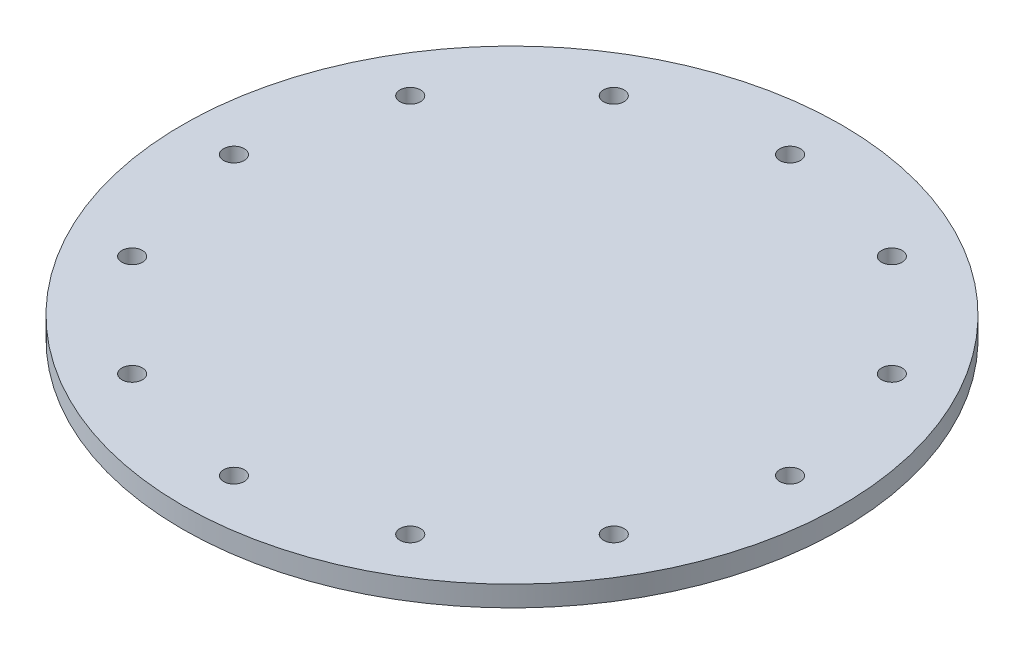
ISO-10303-21;
HEADER;
FILE_DESCRIPTION(('STEP AP214'),'2;1');
FILE_NAME('part.step','',(''),(''),'','','');
FILE_SCHEMA(('AUTOMOTIVE_DESIGN { 1 0 10303 214 1 1 1 1 }'));
ENDSEC;
DATA;
#1=APPLICATION_CONTEXT('core data for automotive mechanical design processes');
#2=APPLICATION_PROTOCOL_DEFINITION('international standard','automotive_design',2000,#1);
#3=PRODUCT_CONTEXT('',#1,'mechanical');
#4=PRODUCT('Part','Part','',(#3));
#5=PRODUCT_RELATED_PRODUCT_CATEGORY('part','',(#4));
#6=PRODUCT_DEFINITION_FORMATION('','',#4);
#7=PRODUCT_DEFINITION_CONTEXT('part definition',#1,'design');
#8=PRODUCT_DEFINITION('design','',#6,#7);
#9=PRODUCT_DEFINITION_SHAPE('','',#8);
#10=(LENGTH_UNIT() NAMED_UNIT(*) SI_UNIT(.MILLI.,.METRE.));
#11=(NAMED_UNIT(*) PLANE_ANGLE_UNIT() SI_UNIT($,.RADIAN.));
#12=(NAMED_UNIT(*) SI_UNIT($,.STERADIAN.) SOLID_ANGLE_UNIT());
#13=UNCERTAINTY_MEASURE_WITH_UNIT(LENGTH_MEASURE(1.E-05),#10,'distance_accuracy_value','');
#14=(GEOMETRIC_REPRESENTATION_CONTEXT(3) GLOBAL_UNCERTAINTY_ASSIGNED_CONTEXT((#13)) GLOBAL_UNIT_ASSIGNED_CONTEXT((#10,
#11,#12)) REPRESENTATION_CONTEXT('',''));
#15=CARTESIAN_POINT('',(0.,0.,0.));
#16=DIRECTION('',(0.,0.,1.));
#17=DIRECTION('',(1.,0.,0.));
#18=AXIS2_PLACEMENT_3D('',#15,#16,#17);
#19=CARTESIAN_POINT('',(0.,6.35,0.));
#20=DIRECTION('',(0.,-1.,0.));
#21=DIRECTION('',(0.,0.,-1.));
#22=AXIS2_PLACEMENT_3D('',#19,#20,#21);
#23=CYLINDRICAL_SURFACE('',#22,101.6);
#24=CARTESIAN_POINT('',(0.,6.35,0.));
#25=DIRECTION('',(0.,1.,0.));
#26=DIRECTION('',(0.,0.,1.));
#27=AXIS2_PLACEMENT_3D('',#24,#25,#26);
#28=CIRCLE('',#27,101.6);
#29=CARTESIAN_POINT('',(0.,6.35,101.6));
#30=VERTEX_POINT('',#29);
#31=EDGE_CURVE('E10',#30,#30,#28,.T.);
#32=ORIENTED_EDGE('',*,*,#31,.F.);
#33=EDGE_LOOP('',(#32));
#34=FACE_BOUND('',#33,.T.);
#35=CARTESIAN_POINT('',(0.,0.,0.));
#36=DIRECTION('',(0.,1.,0.));
#37=DIRECTION('',(0.,0.,1.));
#38=AXIS2_PLACEMENT_3D('',#35,#36,#37);
#39=CIRCLE('',#38,101.6);
#40=CARTESIAN_POINT('',(0.,0.,101.6));
#41=VERTEX_POINT('',#40);
#42=EDGE_CURVE('E38',#41,#41,#39,.T.);
#43=ORIENTED_EDGE('',*,*,#42,.T.);
#44=EDGE_LOOP('',(#43));
#45=FACE_BOUND('',#44,.T.);
#46=ADVANCED_FACE('F35',(#34,#45),#23,.T.);
#47=CARTESIAN_POINT('',(0.,6.35,0.));
#48=DIRECTION('',(0.,1.,0.));
#49=DIRECTION('',(0.,0.,1.));
#50=AXIS2_PLACEMENT_3D('',#47,#48,#49);
#51=PLANE('',#50);
#52=CARTESIAN_POINT('',(-42.8624999999995,6.35,-74.2400277394191));
#53=DIRECTION('',(0.,1.,0.));
#54=DIRECTION('',(0.,0.,1.));
#55=AXIS2_PLACEMENT_3D('',#52,#53,#54);
#56=CIRCLE('',#55,3.1750000000021);
#57=CARTESIAN_POINT('',(-42.8624999999995,6.35,-71.0650277394171));
#58=VERTEX_POINT('',#57);
#59=EDGE_CURVE('E52',#58,#58,#56,.T.);
#60=ORIENTED_EDGE('',*,*,#59,.F.);
#61=EDGE_LOOP('',(#60));
#62=FACE_BOUND('',#61,.T.);
#63=CARTESIAN_POINT('',(42.8625000000001,6.35,-74.2400277394209));
#64=DIRECTION('',(0.,1.,0.));
#65=DIRECTION('',(0.,0.,1.));
#66=AXIS2_PLACEMENT_3D('',#63,#64,#65);
#67=CIRCLE('',#66,3.175);
#68=CARTESIAN_POINT('',(42.8625000000001,6.35,-71.0650277394209));
#69=VERTEX_POINT('',#68);
#70=EDGE_CURVE('E91',#69,#69,#67,.T.);
#71=ORIENTED_EDGE('',*,*,#70,.F.);
#72=EDGE_LOOP('',(#71));
#73=FACE_BOUND('',#72,.T.);
#74=CARTESIAN_POINT('',(74.2400277394228,6.35,-42.8625000000032));
#75=DIRECTION('',(0.,1.,0.));
#76=DIRECTION('',(0.,0.,1.));
#77=AXIS2_PLACEMENT_3D('',#74,#75,#76);
#78=CIRCLE('',#77,3.17500000000101);
#79=CARTESIAN_POINT('',(74.2400277394228,6.35,-39.6875000000022));
#80=VERTEX_POINT('',#79);
#81=EDGE_CURVE('E85',#80,#80,#78,.T.);
#82=ORIENTED_EDGE('',*,*,#81,.F.);
#83=EDGE_LOOP('',(#82));
#84=FACE_BOUND('',#83,.T.);
#85=CARTESIAN_POINT('',(85.7250000000036,6.35,-3.64417827669638E-12));
#86=DIRECTION('',(0.,1.,0.));
#87=DIRECTION('',(0.,0.,1.));
#88=AXIS2_PLACEMENT_3D('',#85,#86,#87);
#89=CIRCLE('',#88,3.1750000000027);
#90=CARTESIAN_POINT('',(85.7250000000036,6.35,3.17499999999906));
#91=VERTEX_POINT('',#90);
#92=EDGE_CURVE('E79',#91,#91,#89,.T.);
#93=ORIENTED_EDGE('',*,*,#92,.F.);
#94=EDGE_LOOP('',(#93));
#95=FACE_BOUND('',#94,.T.);
#96=CARTESIAN_POINT('',(74.2400277394265,6.35,42.8624999999968));
#97=DIRECTION('',(0.,1.,0.));
#98=DIRECTION('',(0.,0.,1.));
#99=AXIS2_PLACEMENT_3D('',#96,#97,#98);
#100=CIRCLE('',#99,3.17500000000469);
#101=CARTESIAN_POINT('',(74.2400277394265,6.35,46.0375000000015));
#102=VERTEX_POINT('',#101);
#103=EDGE_CURVE('E73',#102,#102,#100,.T.);
#104=ORIENTED_EDGE('',*,*,#103,.F.);
#105=EDGE_LOOP('',(#104));
#106=FACE_BOUND('',#105,.T.);
#107=CARTESIAN_POINT('',(42.8625000000068,6.35,74.2400277394192));
#108=DIRECTION('',(0.,1.,0.));
#109=DIRECTION('',(0.,0.,1.));
#110=AXIS2_PLACEMENT_3D('',#107,#108,#109);
#111=CIRCLE('',#110,3.17500000000647);
#112=CARTESIAN_POINT('',(42.8625000000068,6.35,77.4150277394256));
#113=VERTEX_POINT('',#112);
#114=EDGE_CURVE('E67',#113,#113,#111,.T.);
#115=ORIENTED_EDGE('',*,*,#114,.F.);
#116=EDGE_LOOP('',(#115));
#117=FACE_BOUND('',#116,.T.);
#118=CARTESIAN_POINT('',(7.28835655339277E-12,6.35,85.725));
#119=DIRECTION('',(0.,1.,0.));
#120=DIRECTION('',(0.,0.,1.));
#121=AXIS2_PLACEMENT_3D('',#118,#119,#120);
#122=CIRCLE('',#121,3.17500000000754);
#123=CARTESIAN_POINT('',(7.28835655339277E-12,6.35,88.9000000000075));
#124=VERTEX_POINT('',#123);
#125=EDGE_CURVE('E61',#124,#124,#122,.T.);
#126=ORIENTED_EDGE('',*,*,#125,.F.);
#127=EDGE_LOOP('',(#126));
#128=FACE_BOUND('',#127,.T.);
#129=CARTESIAN_POINT('',(-42.8624999999932,6.35,74.2400277394228));
#130=DIRECTION('',(0.,1.,0.));
#131=DIRECTION('',(0.,0.,1.));
#132=AXIS2_PLACEMENT_3D('',#129,#130,#131);
#133=CIRCLE('',#132,3.17500000000773);
#134=CARTESIAN_POINT('',(-42.8624999999932,6.35,77.4150277394306));
#135=VERTEX_POINT('',#134);
#136=EDGE_CURVE('E53',#135,#135,#133,.T.);
#137=ORIENTED_EDGE('',*,*,#136,.F.);
#138=EDGE_LOOP('',(#137));
#139=FACE_BOUND('',#138,.T.);
#140=CARTESIAN_POINT('',(-74.2400277394155,6.35,42.8625000000032));
#141=DIRECTION('',(0.,1.,0.));
#142=DIRECTION('',(0.,0.,1.));
#143=AXIS2_PLACEMENT_3D('',#140,#141,#142);
#144=CIRCLE('',#143,3.17500000000694);
#145=CARTESIAN_POINT('',(-74.2400277394155,6.35,46.0375000000101));
#146=VERTEX_POINT('',#145);
#147=EDGE_CURVE('E60',#146,#146,#144,.T.);
#148=ORIENTED_EDGE('',*,*,#147,.F.);
#149=EDGE_LOOP('',(#148));
#150=FACE_BOUND('',#149,.T.);
#151=CARTESIAN_POINT('',(-85.7249999999964,6.35,3.65467656138208E-12));
#152=DIRECTION('',(0.,1.,0.));
#153=DIRECTION('',(0.,0.,1.));
#154=AXIS2_PLACEMENT_3D('',#151,#152,#153);
#155=CIRCLE('',#154,3.17500000000542);
#156=CARTESIAN_POINT('',(-85.7249999999964,6.35,3.17500000000908));
#157=VERTEX_POINT('',#156);
#158=EDGE_CURVE('E108',#157,#157,#155,.T.);
#159=ORIENTED_EDGE('',*,*,#158,.F.);
#160=EDGE_LOOP('',(#159));
#161=FACE_BOUND('',#160,.T.);
#162=CARTESIAN_POINT('',(0.,6.35,-85.725));
#163=DIRECTION('',(0.,1.,0.));
#164=DIRECTION('',(0.,0.,1.));
#165=AXIS2_PLACEMENT_3D('',#162,#163,#164);
#166=CIRCLE('',#165,3.175);
#167=CARTESIAN_POINT('',(0.,6.35,-82.55));
#168=VERTEX_POINT('',#167);
#169=EDGE_CURVE('E101',#168,#168,#166,.T.);
#170=ORIENTED_EDGE('',*,*,#169,.F.);
#171=EDGE_LOOP('',(#170));
#172=FACE_BOUND('',#171,.T.);
#173=CARTESIAN_POINT('',(-74.2400277394192,6.35,-42.8624999999968));
#174=DIRECTION('',(0.,1.,0.));
#175=DIRECTION('',(0.,0.,1.));
#176=AXIS2_PLACEMENT_3D('',#173,#174,#175);
#177=CIRCLE('',#176,3.17500000000368);
#178=CARTESIAN_POINT('',(-74.2400277394192,6.35,-39.6874999999931));
#179=VERTEX_POINT('',#178);
#180=EDGE_CURVE('E49',#179,#179,#177,.T.);
#181=ORIENTED_EDGE('',*,*,#180,.F.);
#182=EDGE_LOOP('',(#181));
#183=FACE_BOUND('',#182,.T.);
#184=ORIENTED_EDGE('',*,*,#31,.T.);
#185=EDGE_LOOP('',(#184));
#186=FACE_BOUND('',#185,.T.);
#187=ADVANCED_FACE('F125',(#62,#73,#84,#95,#106,#117,#128,#139,#150,#161,#172,#183,#186),#51,.T.);
#188=CARTESIAN_POINT('',(0.,0.,0.));
#189=DIRECTION('',(0.,1.,0.));
#190=DIRECTION('',(0.,0.,1.));
#191=AXIS2_PLACEMENT_3D('',#188,#189,#190);
#192=PLANE('',#191);
#193=CARTESIAN_POINT('',(-42.8624999999995,0.,-74.2400277394191));
#194=DIRECTION('',(0.,1.,0.));
#195=DIRECTION('',(0.,0.,1.));
#196=AXIS2_PLACEMENT_3D('',#193,#194,#195);
#197=CIRCLE('',#196,3.1750000000021);
#198=CARTESIAN_POINT('',(-42.8624999999995,0.,-71.0650277394171));
#199=VERTEX_POINT('',#198);
#200=EDGE_CURVE('E94',#199,#199,#197,.F.);
#201=ORIENTED_EDGE('',*,*,#200,.F.);
#202=EDGE_LOOP('',(#201));
#203=FACE_BOUND('',#202,.T.);
#204=CARTESIAN_POINT('',(42.8625000000001,0.,-74.2400277394209));
#205=DIRECTION('',(0.,1.,0.));
#206=DIRECTION('',(0.,0.,1.));
#207=AXIS2_PLACEMENT_3D('',#204,#205,#206);
#208=CIRCLE('',#207,3.175);
#209=CARTESIAN_POINT('',(42.8625000000001,0.,-71.0650277394209));
#210=VERTEX_POINT('',#209);
#211=EDGE_CURVE('E88',#210,#210,#208,.F.);
#212=ORIENTED_EDGE('',*,*,#211,.F.);
#213=EDGE_LOOP('',(#212));
#214=FACE_BOUND('',#213,.T.);
#215=CARTESIAN_POINT('',(74.2400277394228,0.,-42.8625000000032));
#216=DIRECTION('',(0.,1.,0.));
#217=DIRECTION('',(0.,0.,1.));
#218=AXIS2_PLACEMENT_3D('',#215,#216,#217);
#219=CIRCLE('',#218,3.17500000000101);
#220=CARTESIAN_POINT('',(74.2400277394228,0.,-39.6875000000022));
#221=VERTEX_POINT('',#220);
#222=EDGE_CURVE('E82',#221,#221,#219,.F.);
#223=ORIENTED_EDGE('',*,*,#222,.F.);
#224=EDGE_LOOP('',(#223));
#225=FACE_BOUND('',#224,.T.);
#226=CARTESIAN_POINT('',(85.7250000000036,0.,-3.64417827669638E-12));
#227=DIRECTION('',(0.,1.,0.));
#228=DIRECTION('',(0.,0.,1.));
#229=AXIS2_PLACEMENT_3D('',#226,#227,#228);
#230=CIRCLE('',#229,3.1750000000027);
#231=CARTESIAN_POINT('',(85.7250000000036,0.,3.17499999999906));
#232=VERTEX_POINT('',#231);
#233=EDGE_CURVE('E76',#232,#232,#230,.F.);
#234=ORIENTED_EDGE('',*,*,#233,.F.);
#235=EDGE_LOOP('',(#234));
#236=FACE_BOUND('',#235,.T.);
#237=CARTESIAN_POINT('',(74.2400277394265,0.,42.8624999999968));
#238=DIRECTION('',(0.,1.,0.));
#239=DIRECTION('',(0.,0.,1.));
#240=AXIS2_PLACEMENT_3D('',#237,#238,#239);
#241=CIRCLE('',#240,3.17500000000469);
#242=CARTESIAN_POINT('',(74.2400277394265,0.,46.0375000000015));
#243=VERTEX_POINT('',#242);
#244=EDGE_CURVE('E70',#243,#243,#241,.F.);
#245=ORIENTED_EDGE('',*,*,#244,.F.);
#246=EDGE_LOOP('',(#245));
#247=FACE_BOUND('',#246,.T.);
#248=CARTESIAN_POINT('',(42.8625000000068,0.,74.2400277394192));
#249=DIRECTION('',(0.,1.,0.));
#250=DIRECTION('',(0.,0.,1.));
#251=AXIS2_PLACEMENT_3D('',#248,#249,#250);
#252=CIRCLE('',#251,3.17500000000647);
#253=CARTESIAN_POINT('',(42.8625000000068,0.,77.4150277394256));
#254=VERTEX_POINT('',#253);
#255=EDGE_CURVE('E64',#254,#254,#252,.F.);
#256=ORIENTED_EDGE('',*,*,#255,.F.);
#257=EDGE_LOOP('',(#256));
#258=FACE_BOUND('',#257,.T.);
#259=CARTESIAN_POINT('',(7.28835655339277E-12,0.,85.725));
#260=DIRECTION('',(0.,1.,0.));
#261=DIRECTION('',(0.,0.,1.));
#262=AXIS2_PLACEMENT_3D('',#259,#260,#261);
#263=CIRCLE('',#262,3.17500000000754);
#264=CARTESIAN_POINT('',(7.28835655339277E-12,0.,88.9000000000075));
#265=VERTEX_POINT('',#264);
#266=EDGE_CURVE('E56',#265,#265,#263,.F.);
#267=ORIENTED_EDGE('',*,*,#266,.F.);
#268=EDGE_LOOP('',(#267));
#269=FACE_BOUND('',#268,.T.);
#270=CARTESIAN_POINT('',(-42.8624999999932,0.,74.2400277394228));
#271=DIRECTION('',(0.,1.,0.));
#272=DIRECTION('',(0.,0.,1.));
#273=AXIS2_PLACEMENT_3D('',#270,#271,#272);
#274=CIRCLE('',#273,3.17500000000773);
#275=CARTESIAN_POINT('',(-42.8624999999932,0.,77.4150277394306));
#276=VERTEX_POINT('',#275);
#277=EDGE_CURVE('E57',#276,#276,#274,.F.);
#278=ORIENTED_EDGE('',*,*,#277,.F.);
#279=EDGE_LOOP('',(#278));
#280=FACE_BOUND('',#279,.T.);
#281=CARTESIAN_POINT('',(-74.2400277394155,0.,42.8625000000032));
#282=DIRECTION('',(0.,1.,0.));
#283=DIRECTION('',(0.,0.,1.));
#284=AXIS2_PLACEMENT_3D('',#281,#282,#283);
#285=CIRCLE('',#284,3.17500000000694);
#286=CARTESIAN_POINT('',(-74.2400277394155,0.,46.0375000000101));
#287=VERTEX_POINT('',#286);
#288=EDGE_CURVE('E111',#287,#287,#285,.F.);
#289=ORIENTED_EDGE('',*,*,#288,.F.);
#290=EDGE_LOOP('',(#289));
#291=FACE_BOUND('',#290,.T.);
#292=CARTESIAN_POINT('',(-85.7249999999964,0.,3.65467656138208E-12));
#293=DIRECTION('',(0.,1.,0.));
#294=DIRECTION('',(0.,0.,1.));
#295=AXIS2_PLACEMENT_3D('',#292,#293,#294);
#296=CIRCLE('',#295,3.17500000000542);
#297=CARTESIAN_POINT('',(-85.7249999999964,0.,3.17500000000908));
#298=VERTEX_POINT('',#297);
#299=EDGE_CURVE('E104',#298,#298,#296,.F.);
#300=ORIENTED_EDGE('',*,*,#299,.F.);
#301=EDGE_LOOP('',(#300));
#302=FACE_BOUND('',#301,.T.);
#303=CARTESIAN_POINT('',(0.,0.,-85.725));
#304=DIRECTION('',(0.,1.,0.));
#305=DIRECTION('',(0.,0.,1.));
#306=AXIS2_PLACEMENT_3D('',#303,#304,#305);
#307=CIRCLE('',#306,3.175);
#308=CARTESIAN_POINT('',(0.,0.,-82.55));
#309=VERTEX_POINT('',#308);
#310=EDGE_CURVE('E105',#309,#309,#307,.F.);
#311=ORIENTED_EDGE('',*,*,#310,.F.);
#312=EDGE_LOOP('',(#311));
#313=FACE_BOUND('',#312,.T.);
#314=CARTESIAN_POINT('',(-74.2400277394192,0.,-42.8624999999968));
#315=DIRECTION('',(0.,1.,0.));
#316=DIRECTION('',(0.,0.,1.));
#317=AXIS2_PLACEMENT_3D('',#314,#315,#316);
#318=CIRCLE('',#317,3.17500000000368);
#319=CARTESIAN_POINT('',(-74.2400277394192,0.,-39.6874999999931));
#320=VERTEX_POINT('',#319);
#321=EDGE_CURVE('E45',#320,#320,#318,.F.);
#322=ORIENTED_EDGE('',*,*,#321,.F.);
#323=EDGE_LOOP('',(#322));
#324=FACE_BOUND('',#323,.T.);
#325=ORIENTED_EDGE('',*,*,#42,.F.);
#326=EDGE_LOOP('',(#325));
#327=FACE_BOUND('',#326,.T.);
#328=ADVANCED_FACE('F121',(#203,#214,#225,#236,#247,#258,#269,#280,#291,#302,#313,#324,#327),
#192,.F.);
#329=CARTESIAN_POINT('',(-74.2400277394192,-0.00100000000000013,-42.8624999999968));
#330=DIRECTION('',(0.,1.,0.));
#331=DIRECTION('',(0.,0.,1.));
#332=AXIS2_PLACEMENT_3D('',#329,#330,#331);
#333=CYLINDRICAL_SURFACE('',#332,3.17500000000368);
#334=ORIENTED_EDGE('',*,*,#180,.T.);
#335=EDGE_LOOP('',(#334));
#336=FACE_BOUND('',#335,.T.);
#337=ORIENTED_EDGE('',*,*,#321,.T.);
#338=EDGE_LOOP('',(#337));
#339=FACE_BOUND('',#338,.T.);
#340=ADVANCED_FACE('F124',(#336,#339),#333,.F.);
#341=CARTESIAN_POINT('',(0.,-0.00100000000000013,-85.725));
#342=DIRECTION('',(0.,1.,0.));
#343=DIRECTION('',(0.,0.,1.));
#344=AXIS2_PLACEMENT_3D('',#341,#342,#343);
#345=CYLINDRICAL_SURFACE('',#344,3.175);
#346=ORIENTED_EDGE('',*,*,#169,.T.);
#347=EDGE_LOOP('',(#346));
#348=FACE_BOUND('',#347,.T.);
#349=ORIENTED_EDGE('',*,*,#310,.T.);
#350=EDGE_LOOP('',(#349));
#351=FACE_BOUND('',#350,.T.);
#352=ADVANCED_FACE('F149',(#348,#351),#345,.F.);
#353=CARTESIAN_POINT('',(-85.7249999999964,-0.00100000000000013,3.65467656138208E-12));
#354=DIRECTION('',(0.,1.,0.));
#355=DIRECTION('',(0.,0.,1.));
#356=AXIS2_PLACEMENT_3D('',#353,#354,#355);
#357=CYLINDRICAL_SURFACE('',#356,3.17500000000542);
#358=ORIENTED_EDGE('',*,*,#158,.T.);
#359=EDGE_LOOP('',(#358));
#360=FACE_BOUND('',#359,.T.);
#361=ORIENTED_EDGE('',*,*,#299,.T.);
#362=EDGE_LOOP('',(#361));
#363=FACE_BOUND('',#362,.T.);
#364=ADVANCED_FACE('F185',(#360,#363),#357,.F.);
#365=CARTESIAN_POINT('',(-74.2400277394155,-0.00100000000000013,42.8625000000032));
#366=DIRECTION('',(0.,1.,0.));
#367=DIRECTION('',(0.,0.,1.));
#368=AXIS2_PLACEMENT_3D('',#365,#366,#367);
#369=CYLINDRICAL_SURFACE('',#368,3.17500000000694);
#370=ORIENTED_EDGE('',*,*,#147,.T.);
#371=EDGE_LOOP('',(#370));
#372=FACE_BOUND('',#371,.T.);
#373=ORIENTED_EDGE('',*,*,#288,.T.);
#374=EDGE_LOOP('',(#373));
#375=FACE_BOUND('',#374,.T.);
#376=ADVANCED_FACE('F119',(#372,#375),#369,.F.);
#377=CARTESIAN_POINT('',(-42.8624999999932,-0.00100000000000013,74.2400277394228));
#378=DIRECTION('',(0.,1.,0.));
#379=DIRECTION('',(0.,0.,1.));
#380=AXIS2_PLACEMENT_3D('',#377,#378,#379);
#381=CYLINDRICAL_SURFACE('',#380,3.17500000000773);
#382=ORIENTED_EDGE('',*,*,#136,.T.);
#383=EDGE_LOOP('',(#382));
#384=FACE_BOUND('',#383,.T.);
#385=ORIENTED_EDGE('',*,*,#277,.T.);
#386=EDGE_LOOP('',(#385));
#387=FACE_BOUND('',#386,.T.);
#388=ADVANCED_FACE('F151',(#384,#387),#381,.F.);
#389=CARTESIAN_POINT('',(7.28835655339277E-12,-0.00100000000000013,85.725));
#390=DIRECTION('',(0.,1.,0.));
#391=DIRECTION('',(0.,0.,1.));
#392=AXIS2_PLACEMENT_3D('',#389,#390,#391);
#393=CYLINDRICAL_SURFACE('',#392,3.17500000000754);
#394=ORIENTED_EDGE('',*,*,#125,.T.);
#395=EDGE_LOOP('',(#394));
#396=FACE_BOUND('',#395,.T.);
#397=ORIENTED_EDGE('',*,*,#266,.T.);
#398=EDGE_LOOP('',(#397));
#399=FACE_BOUND('',#398,.T.);
#400=ADVANCED_FACE('F154',(#396,#399),#393,.F.);
#401=CARTESIAN_POINT('',(42.8625000000068,-0.00100000000000013,74.2400277394192));
#402=DIRECTION('',(0.,1.,0.));
#403=DIRECTION('',(0.,0.,1.));
#404=AXIS2_PLACEMENT_3D('',#401,#402,#403);
#405=CYLINDRICAL_SURFACE('',#404,3.17500000000647);
#406=ORIENTED_EDGE('',*,*,#114,.T.);
#407=EDGE_LOOP('',(#406));
#408=FACE_BOUND('',#407,.T.);
#409=ORIENTED_EDGE('',*,*,#255,.T.);
#410=EDGE_LOOP('',(#409));
#411=FACE_BOUND('',#410,.T.);
#412=ADVANCED_FACE('F158',(#408,#411),#405,.F.);
#413=CARTESIAN_POINT('',(74.2400277394265,-0.00100000000000013,42.8624999999968));
#414=DIRECTION('',(0.,1.,0.));
#415=DIRECTION('',(0.,0.,1.));
#416=AXIS2_PLACEMENT_3D('',#413,#414,#415);
#417=CYLINDRICAL_SURFACE('',#416,3.17500000000469);
#418=ORIENTED_EDGE('',*,*,#103,.T.);
#419=EDGE_LOOP('',(#418));
#420=FACE_BOUND('',#419,.T.);
#421=ORIENTED_EDGE('',*,*,#244,.T.);
#422=EDGE_LOOP('',(#421));
#423=FACE_BOUND('',#422,.T.);
#424=ADVANCED_FACE('F162',(#420,#423),#417,.F.);
#425=CARTESIAN_POINT('',(85.7250000000036,-0.00100000000000013,-3.64417827669638E-12));
#426=DIRECTION('',(0.,1.,0.));
#427=DIRECTION('',(0.,0.,1.));
#428=AXIS2_PLACEMENT_3D('',#425,#426,#427);
#429=CYLINDRICAL_SURFACE('',#428,3.1750000000027);
#430=ORIENTED_EDGE('',*,*,#92,.T.);
#431=EDGE_LOOP('',(#430));
#432=FACE_BOUND('',#431,.T.);
#433=ORIENTED_EDGE('',*,*,#233,.T.);
#434=EDGE_LOOP('',(#433));
#435=FACE_BOUND('',#434,.T.);
#436=ADVANCED_FACE('F166',(#432,#435),#429,.F.);
#437=CARTESIAN_POINT('',(74.2400277394228,-0.00100000000000013,-42.8625000000032));
#438=DIRECTION('',(0.,1.,0.));
#439=DIRECTION('',(0.,0.,1.));
#440=AXIS2_PLACEMENT_3D('',#437,#438,#439);
#441=CYLINDRICAL_SURFACE('',#440,3.17500000000101);
#442=ORIENTED_EDGE('',*,*,#81,.T.);
#443=EDGE_LOOP('',(#442));
#444=FACE_BOUND('',#443,.T.);
#445=ORIENTED_EDGE('',*,*,#222,.T.);
#446=EDGE_LOOP('',(#445));
#447=FACE_BOUND('',#446,.T.);
#448=ADVANCED_FACE('F170',(#444,#447),#441,.F.);
#449=CARTESIAN_POINT('',(42.8625000000001,-0.00100000000000013,-74.2400277394209));
#450=DIRECTION('',(0.,1.,0.));
#451=DIRECTION('',(0.,0.,1.));
#452=AXIS2_PLACEMENT_3D('',#449,#450,#451);
#453=CYLINDRICAL_SURFACE('',#452,3.175);
#454=ORIENTED_EDGE('',*,*,#70,.T.);
#455=EDGE_LOOP('',(#454));
#456=FACE_BOUND('',#455,.T.);
#457=ORIENTED_EDGE('',*,*,#211,.T.);
#458=EDGE_LOOP('',(#457));
#459=FACE_BOUND('',#458,.T.);
#460=ADVANCED_FACE('F174',(#456,#459),#453,.F.);
#461=CARTESIAN_POINT('',(-42.8624999999995,-0.00100000000000013,-74.2400277394191));
#462=DIRECTION('',(0.,1.,0.));
#463=DIRECTION('',(0.,0.,1.));
#464=AXIS2_PLACEMENT_3D('',#461,#462,#463);
#465=CYLINDRICAL_SURFACE('',#464,3.1750000000021);
#466=ORIENTED_EDGE('',*,*,#59,.T.);
#467=EDGE_LOOP('',(#466));
#468=FACE_BOUND('',#467,.T.);
#469=ORIENTED_EDGE('',*,*,#200,.T.);
#470=EDGE_LOOP('',(#469));
#471=FACE_BOUND('',#470,.T.);
#472=ADVANCED_FACE('F178',(#468,#471),#465,.F.);
#473=CLOSED_SHELL('',(#46,#187,#328,#340,#352,#364,#376,#388,#400,#412,#424,#436,#448,#460,#472));
#474=MANIFOLD_SOLID_BREP('B2',#473);
#475=ADVANCED_BREP_SHAPE_REPRESENTATION('',(#18,#474),#14);
#476=SHAPE_DEFINITION_REPRESENTATION(#9,#475);
ENDSEC;
END-ISO-10303-21;
